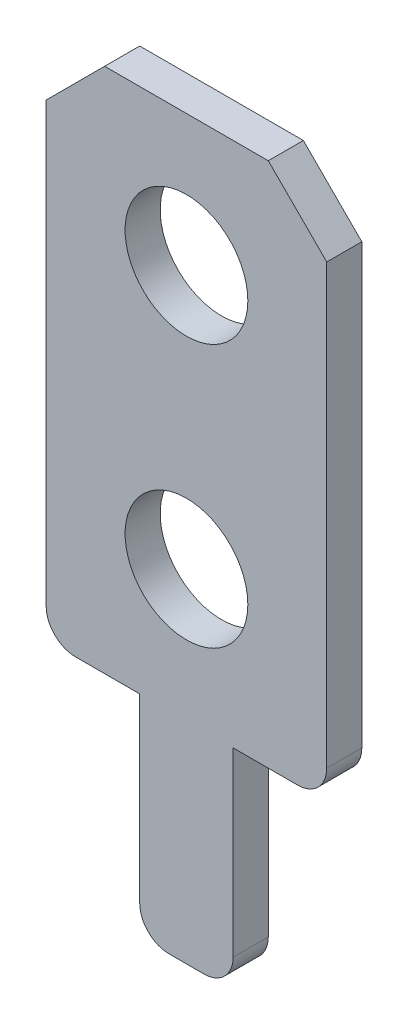
ISO-10303-21;
HEADER;
FILE_DESCRIPTION(('STEP AP214'),'2;1');
FILE_NAME('part.step','',(''),(''),'','','');
FILE_SCHEMA(('AUTOMOTIVE_DESIGN { 1 0 10303 214 1 1 1 1 }'));
ENDSEC;
DATA;
#1=APPLICATION_CONTEXT('core data for automotive mechanical design processes');
#2=APPLICATION_PROTOCOL_DEFINITION('international standard','automotive_design',2000,#1);
#3=PRODUCT_CONTEXT('',#1,'mechanical');
#4=PRODUCT('Part','Part','',(#3));
#5=PRODUCT_RELATED_PRODUCT_CATEGORY('part','',(#4));
#6=PRODUCT_DEFINITION_FORMATION('','',#4);
#7=PRODUCT_DEFINITION_CONTEXT('part definition',#1,'design');
#8=PRODUCT_DEFINITION('design','',#6,#7);
#9=PRODUCT_DEFINITION_SHAPE('','',#8);
#10=(LENGTH_UNIT() NAMED_UNIT(*) SI_UNIT(.MILLI.,.METRE.));
#11=(NAMED_UNIT(*) PLANE_ANGLE_UNIT() SI_UNIT($,.RADIAN.));
#12=(NAMED_UNIT(*) SI_UNIT($,.STERADIAN.) SOLID_ANGLE_UNIT());
#13=UNCERTAINTY_MEASURE_WITH_UNIT(LENGTH_MEASURE(1.E-05),#10,'distance_accuracy_value','');
#14=(GEOMETRIC_REPRESENTATION_CONTEXT(3) GLOBAL_UNCERTAINTY_ASSIGNED_CONTEXT((#13)) GLOBAL_UNIT_ASSIGNED_CONTEXT((#10,
#11,#12)) REPRESENTATION_CONTEXT('',''));
#15=CARTESIAN_POINT('',(0.,0.,0.));
#16=DIRECTION('',(0.,0.,1.));
#17=DIRECTION('',(1.,0.,0.));
#18=AXIS2_PLACEMENT_3D('',#15,#16,#17);
#19=CARTESIAN_POINT('',(0.,0.,0.6));
#20=DIRECTION('',(0.,0.,1.));
#21=DIRECTION('',(1.,0.,0.));
#22=AXIS2_PLACEMENT_3D('',#19,#20,#21);
#23=PLANE('',#22);
#24=CARTESIAN_POINT('',(0.,6.75,0.6));
#25=DIRECTION('',(0.,0.,1.));
#26=DIRECTION('',(1.,0.,0.));
#27=AXIS2_PLACEMENT_3D('',#24,#25,#26);
#28=CIRCLE('',#27,1.05);
#29=CARTESIAN_POINT('',(1.05,6.75,0.6));
#30=VERTEX_POINT('',#29);
#31=EDGE_CURVE('E205',#30,#30,#28,.F.);
#32=ORIENTED_EDGE('',*,*,#31,.T.);
#33=EDGE_LOOP('',(#32));
#34=FACE_BOUND('',#33,.T.);
#35=CARTESIAN_POINT('',(0.,2.25,0.6));
#36=DIRECTION('',(0.,0.,1.));
#37=DIRECTION('',(1.,0.,0.));
#38=AXIS2_PLACEMENT_3D('',#35,#36,#37);
#39=CIRCLE('',#38,1.05);
#40=CARTESIAN_POINT('',(1.05,2.25,0.6));
#41=VERTEX_POINT('',#40);
#42=EDGE_CURVE('E208',#41,#41,#39,.F.);
#43=ORIENTED_EDGE('',*,*,#42,.T.);
#44=EDGE_LOOP('',(#43));
#45=FACE_BOUND('',#44,.T.);
#46=DIRECTION('',(0.,1.,0.));
#47=VECTOR('',#46,1.);
#48=CARTESIAN_POINT('',(-2.4,9.,0.6));
#49=LINE('',#48,#47);
#50=CARTESIAN_POINT('',(-2.4,0.5,0.6));
#51=VERTEX_POINT('',#50);
#52=CARTESIAN_POINT('',(-2.4,8.,0.6));
#53=VERTEX_POINT('',#52);
#54=EDGE_CURVE('E129',#51,#53,#49,.T.);
#55=ORIENTED_EDGE('',*,*,#54,.F.);
#56=CARTESIAN_POINT('',(-1.9,0.5,0.6));
#57=DIRECTION('',(0.,0.,-1.));
#58=DIRECTION('',(-1.,0.,0.));
#59=AXIS2_PLACEMENT_3D('',#56,#57,#58);
#60=CIRCLE('',#59,0.5);
#61=CARTESIAN_POINT('',(-1.9,0.,0.6));
#62=VERTEX_POINT('',#61);
#63=EDGE_CURVE('E20',#62,#51,#60,.T.);
#64=ORIENTED_EDGE('',*,*,#63,.F.);
#65=DIRECTION('',(1.,0.,0.));
#66=VECTOR('',#65,1.);
#67=CARTESIAN_POINT('',(-2.4,0.,0.6));
#68=LINE('',#67,#66);
#69=CARTESIAN_POINT('',(-0.8,0.,0.6));
#70=VERTEX_POINT('',#69);
#71=EDGE_CURVE('E115',#70,#62,#68,.F.);
#72=ORIENTED_EDGE('',*,*,#71,.F.);
#73=DIRECTION('',(0.,1.,0.));
#74=VECTOR('',#73,1.);
#75=CARTESIAN_POINT('',(-0.8,0.,0.6));
#76=LINE('',#75,#74);
#77=CARTESIAN_POINT('',(-0.8,-3.1,0.6));
#78=VERTEX_POINT('',#77);
#79=EDGE_CURVE('E136',#78,#70,#76,.T.);
#80=ORIENTED_EDGE('',*,*,#79,.F.);
#81=CARTESIAN_POINT('',(-0.3,-3.1,0.6));
#82=DIRECTION('',(0.,0.,-1.));
#83=DIRECTION('',(-1.,0.,0.));
#84=AXIS2_PLACEMENT_3D('',#81,#82,#83);
#85=CIRCLE('',#84,0.5);
#86=CARTESIAN_POINT('',(-0.3,-3.6,0.6));
#87=VERTEX_POINT('',#86);
#88=EDGE_CURVE('E215',#87,#78,#85,.T.);
#89=ORIENTED_EDGE('',*,*,#88,.F.);
#90=DIRECTION('',(1.,0.,0.));
#91=VECTOR('',#90,1.);
#92=CARTESIAN_POINT('',(-0.8,-3.6,0.6));
#93=LINE('',#92,#91);
#94=CARTESIAN_POINT('',(0.3,-3.6,0.6));
#95=VERTEX_POINT('',#94);
#96=EDGE_CURVE('E178',#95,#87,#93,.F.);
#97=ORIENTED_EDGE('',*,*,#96,.F.);
#98=CARTESIAN_POINT('',(0.3,-3.1,0.6));
#99=DIRECTION('',(0.,0.,-1.));
#100=DIRECTION('',(-1.,0.,0.));
#101=AXIS2_PLACEMENT_3D('',#98,#99,#100);
#102=CIRCLE('',#101,0.5);
#103=CARTESIAN_POINT('',(0.8,-3.1,0.6));
#104=VERTEX_POINT('',#103);
#105=EDGE_CURVE('E214',#104,#95,#102,.T.);
#106=ORIENTED_EDGE('',*,*,#105,.F.);
#107=DIRECTION('',(0.,1.,0.));
#108=VECTOR('',#107,1.);
#109=CARTESIAN_POINT('',(0.8,-3.6,0.6));
#110=LINE('',#109,#108);
#111=CARTESIAN_POINT('',(0.8,0.,0.6));
#112=VERTEX_POINT('',#111);
#113=EDGE_CURVE('E173',#112,#104,#110,.F.);
#114=ORIENTED_EDGE('',*,*,#113,.F.);
#115=DIRECTION('',(1.,0.,0.));
#116=VECTOR('',#115,1.);
#117=CARTESIAN_POINT('',(0.8,0.,0.6));
#118=LINE('',#117,#116);
#119=CARTESIAN_POINT('',(1.9,0.,0.6));
#120=VERTEX_POINT('',#119);
#121=EDGE_CURVE('E167',#120,#112,#118,.F.);
#122=ORIENTED_EDGE('',*,*,#121,.F.);
#123=CARTESIAN_POINT('',(1.9,0.5,0.6));
#124=DIRECTION('',(0.,0.,-1.));
#125=DIRECTION('',(-1.,0.,0.));
#126=AXIS2_PLACEMENT_3D('',#123,#124,#125);
#127=CIRCLE('',#126,0.5);
#128=CARTESIAN_POINT('',(2.4,0.5,0.6));
#129=VERTEX_POINT('',#128);
#130=EDGE_CURVE('E212',#129,#120,#127,.T.);
#131=ORIENTED_EDGE('',*,*,#130,.F.);
#132=DIRECTION('',(0.,1.,0.));
#133=VECTOR('',#132,1.);
#134=CARTESIAN_POINT('',(2.4,0.,0.6));
#135=LINE('',#134,#133);
#136=CARTESIAN_POINT('',(2.4,8.,0.6));
#137=VERTEX_POINT('',#136);
#138=EDGE_CURVE('E162',#137,#129,#135,.F.);
#139=ORIENTED_EDGE('',*,*,#138,.F.);
#140=DIRECTION('',(-0.707106781186548,0.707106781186548,0.));
#141=VECTOR('',#140,1.);
#142=CARTESIAN_POINT('',(1.9,8.5,0.6));
#143=LINE('',#142,#141);
#144=CARTESIAN_POINT('',(1.4,9.,0.6));
#145=VERTEX_POINT('',#144);
#146=EDGE_CURVE('E157',#145,#137,#143,.F.);
#147=ORIENTED_EDGE('',*,*,#146,.F.);
#148=DIRECTION('',(1.,0.,0.));
#149=VECTOR('',#148,1.);
#150=CARTESIAN_POINT('',(2.4,9.,0.6));
#151=LINE('',#150,#149);
#152=CARTESIAN_POINT('',(-1.4,9.,0.6));
#153=VERTEX_POINT('',#152);
#154=EDGE_CURVE('E152',#153,#145,#151,.T.);
#155=ORIENTED_EDGE('',*,*,#154,.F.);
#156=DIRECTION('',(-0.707106781186548,-0.707106781186548,0.));
#157=VECTOR('',#156,1.);
#158=CARTESIAN_POINT('',(-1.9,8.5,0.6));
#159=LINE('',#158,#157);
#160=EDGE_CURVE('E147',#53,#153,#159,.F.);
#161=ORIENTED_EDGE('',*,*,#160,.F.);
#162=EDGE_LOOP('',(#55,#64,#72,#80,#89,#97,#106,#114,#122,#131,#139,#147,#155,#161));
#163=FACE_BOUND('',#162,.T.);
#164=ADVANCED_FACE('F17',(#34,#45,#163),#23,.T.);
#165=CARTESIAN_POINT('',(-1.9,0.5,1.38216));
#166=DIRECTION('',(0.,0.,-1.));
#167=DIRECTION('',(-1.,0.,0.));
#168=AXIS2_PLACEMENT_3D('',#165,#166,#167);
#169=CYLINDRICAL_SURFACE('',#168,0.5);
#170=DIRECTION('',(0.,0.,1.));
#171=VECTOR('',#170,1.);
#172=CARTESIAN_POINT('',(-2.4,0.5,0.));
#173=LINE('',#172,#171);
#174=CARTESIAN_POINT('',(-2.4,0.5,0.));
#175=VERTEX_POINT('',#174);
#176=EDGE_CURVE('E211',#175,#51,#173,.T.);
#177=ORIENTED_EDGE('',*,*,#176,.F.);
#178=CARTESIAN_POINT('',(-1.9,0.5,0.));
#179=DIRECTION('',(0.,0.,-1.));
#180=DIRECTION('',(-1.,0.,0.));
#181=AXIS2_PLACEMENT_3D('',#178,#179,#180);
#182=CIRCLE('',#181,0.5);
#183=CARTESIAN_POINT('',(-1.9,0.,0.));
#184=VERTEX_POINT('',#183);
#185=EDGE_CURVE('E135',#175,#184,#182,.F.);
#186=ORIENTED_EDGE('',*,*,#185,.T.);
#187=DIRECTION('',(0.,0.,-1.));
#188=VECTOR('',#187,1.);
#189=CARTESIAN_POINT('',(-1.9,0.,0.));
#190=LINE('',#189,#188);
#191=EDGE_CURVE('E120',#62,#184,#190,.T.);
#192=ORIENTED_EDGE('',*,*,#191,.F.);
#193=ORIENTED_EDGE('',*,*,#63,.T.);
#194=EDGE_LOOP('',(#177,#186,#192,#193));
#195=FACE_BOUND('',#194,.T.);
#196=ADVANCED_FACE('F134',(#195),#169,.T.);
#197=CARTESIAN_POINT('',(-2.4,0.,0.));
#198=DIRECTION('',(0.,-1.,0.));
#199=DIRECTION('',(0.,0.,-1.));
#200=AXIS2_PLACEMENT_3D('',#197,#198,#199);
#201=PLANE('',#200);
#202=ORIENTED_EDGE('',*,*,#71,.T.);
#203=ORIENTED_EDGE('',*,*,#191,.T.);
#204=DIRECTION('',(1.,0.,0.));
#205=VECTOR('',#204,1.);
#206=CARTESIAN_POINT('',(0.,0.,0.));
#207=LINE('',#206,#205);
#208=CARTESIAN_POINT('',(-0.8,0.,0.));
#209=VERTEX_POINT('',#208);
#210=EDGE_CURVE('E204',#184,#209,#207,.T.);
#211=ORIENTED_EDGE('',*,*,#210,.T.);
#212=DIRECTION('',(0.,0.,1.));
#213=VECTOR('',#212,1.);
#214=CARTESIAN_POINT('',(-0.8,0.,0.));
#215=LINE('',#214,#213);
#216=EDGE_CURVE('E122',#70,#209,#215,.F.);
#217=ORIENTED_EDGE('',*,*,#216,.F.);
#218=EDGE_LOOP('',(#202,#203,#211,#217));
#219=FACE_BOUND('',#218,.T.);
#220=ADVANCED_FACE('F117',(#219),#201,.T.);
#221=CARTESIAN_POINT('',(-0.8,0.,0.));
#222=DIRECTION('',(-1.,0.,0.));
#223=DIRECTION('',(0.,0.,1.));
#224=AXIS2_PLACEMENT_3D('',#221,#222,#223);
#225=PLANE('',#224);
#226=DIRECTION('',(0.,1.,0.));
#227=VECTOR('',#226,1.);
#228=CARTESIAN_POINT('',(-0.8,0.,0.));
#229=LINE('',#228,#227);
#230=CARTESIAN_POINT('',(-0.8,-3.1,0.));
#231=VERTEX_POINT('',#230);
#232=EDGE_CURVE('E202',#209,#231,#229,.F.);
#233=ORIENTED_EDGE('',*,*,#232,.T.);
#234=DIRECTION('',(0.,0.,-1.));
#235=VECTOR('',#234,1.);
#236=CARTESIAN_POINT('',(-0.8,-3.1,1.38216));
#237=LINE('',#236,#235);
#238=EDGE_CURVE('E180',#78,#231,#237,.T.);
#239=ORIENTED_EDGE('',*,*,#238,.F.);
#240=ORIENTED_EDGE('',*,*,#79,.T.);
#241=ORIENTED_EDGE('',*,*,#216,.T.);
#242=EDGE_LOOP('',(#233,#239,#240,#241));
#243=FACE_BOUND('',#242,.T.);
#244=ADVANCED_FACE('F331',(#243),#225,.T.);
#245=CARTESIAN_POINT('',(-0.3,-3.1,1.38216));
#246=DIRECTION('',(0.,0.,-1.));
#247=DIRECTION('',(-1.,0.,0.));
#248=AXIS2_PLACEMENT_3D('',#245,#246,#247);
#249=CYLINDRICAL_SURFACE('',#248,0.5);
#250=ORIENTED_EDGE('',*,*,#238,.T.);
#251=CARTESIAN_POINT('',(-0.3,-3.1,0.));
#252=DIRECTION('',(0.,0.,-1.));
#253=DIRECTION('',(-1.,0.,0.));
#254=AXIS2_PLACEMENT_3D('',#251,#252,#253);
#255=CIRCLE('',#254,0.5);
#256=CARTESIAN_POINT('',(-0.3,-3.6,0.));
#257=VERTEX_POINT('',#256);
#258=EDGE_CURVE('E199',#231,#257,#255,.F.);
#259=ORIENTED_EDGE('',*,*,#258,.T.);
#260=DIRECTION('',(0.,0.,-1.));
#261=VECTOR('',#260,1.);
#262=CARTESIAN_POINT('',(-0.3,-3.6,0.));
#263=LINE('',#262,#261);
#264=EDGE_CURVE('E179',#87,#257,#263,.T.);
#265=ORIENTED_EDGE('',*,*,#264,.F.);
#266=ORIENTED_EDGE('',*,*,#88,.T.);
#267=EDGE_LOOP('',(#250,#259,#265,#266));
#268=FACE_BOUND('',#267,.T.);
#269=ADVANCED_FACE('F329',(#268),#249,.T.);
#270=CARTESIAN_POINT('',(-0.8,-3.6,0.));
#271=DIRECTION('',(0.,-1.,0.));
#272=DIRECTION('',(0.,0.,-1.));
#273=AXIS2_PLACEMENT_3D('',#270,#271,#272);
#274=PLANE('',#273);
#275=ORIENTED_EDGE('',*,*,#96,.T.);
#276=ORIENTED_EDGE('',*,*,#264,.T.);
#277=DIRECTION('',(1.,0.,0.));
#278=VECTOR('',#277,1.);
#279=CARTESIAN_POINT('',(0.,-3.6,0.));
#280=LINE('',#279,#278);
#281=CARTESIAN_POINT('',(0.3,-3.6,0.));
#282=VERTEX_POINT('',#281);
#283=EDGE_CURVE('E198',#257,#282,#280,.T.);
#284=ORIENTED_EDGE('',*,*,#283,.T.);
#285=DIRECTION('',(0.,0.,-1.));
#286=VECTOR('',#285,1.);
#287=CARTESIAN_POINT('',(0.3,-3.6,1.38216));
#288=LINE('',#287,#286);
#289=EDGE_CURVE('E175',#95,#282,#288,.T.);
#290=ORIENTED_EDGE('',*,*,#289,.F.);
#291=EDGE_LOOP('',(#275,#276,#284,#290));
#292=FACE_BOUND('',#291,.T.);
#293=ADVANCED_FACE('F328',(#292),#274,.T.);
#294=CARTESIAN_POINT('',(0.3,-3.1,1.38216));
#295=DIRECTION('',(0.,0.,-1.));
#296=DIRECTION('',(-1.,0.,0.));
#297=AXIS2_PLACEMENT_3D('',#294,#295,#296);
#298=CYLINDRICAL_SURFACE('',#297,0.5);
#299=ORIENTED_EDGE('',*,*,#289,.T.);
#300=CARTESIAN_POINT('',(0.3,-3.1,0.));
#301=DIRECTION('',(0.,0.,-1.));
#302=DIRECTION('',(-1.,0.,0.));
#303=AXIS2_PLACEMENT_3D('',#300,#301,#302);
#304=CIRCLE('',#303,0.5);
#305=CARTESIAN_POINT('',(0.8,-3.1,0.));
#306=VERTEX_POINT('',#305);
#307=EDGE_CURVE('E194',#282,#306,#304,.F.);
#308=ORIENTED_EDGE('',*,*,#307,.T.);
#309=DIRECTION('',(0.,0.,-1.));
#310=VECTOR('',#309,1.);
#311=CARTESIAN_POINT('',(0.8,-3.1,0.));
#312=LINE('',#311,#310);
#313=EDGE_CURVE('E170',#104,#306,#312,.T.);
#314=ORIENTED_EDGE('',*,*,#313,.F.);
#315=ORIENTED_EDGE('',*,*,#105,.T.);
#316=EDGE_LOOP('',(#299,#308,#314,#315));
#317=FACE_BOUND('',#316,.T.);
#318=ADVANCED_FACE('F322',(#317),#298,.T.);
#319=CARTESIAN_POINT('',(0.8,-3.6,0.));
#320=DIRECTION('',(1.,0.,0.));
#321=DIRECTION('',(0.,0.,-1.));
#322=AXIS2_PLACEMENT_3D('',#319,#320,#321);
#323=PLANE('',#322);
#324=ORIENTED_EDGE('',*,*,#113,.T.);
#325=ORIENTED_EDGE('',*,*,#313,.T.);
#326=DIRECTION('',(0.,1.,0.));
#327=VECTOR('',#326,1.);
#328=CARTESIAN_POINT('',(0.8,0.,0.));
#329=LINE('',#328,#327);
#330=CARTESIAN_POINT('',(0.8,0.,0.));
#331=VERTEX_POINT('',#330);
#332=EDGE_CURVE('E197',#306,#331,#329,.T.);
#333=ORIENTED_EDGE('',*,*,#332,.T.);
#334=DIRECTION('',(0.,0.,-1.));
#335=VECTOR('',#334,1.);
#336=CARTESIAN_POINT('',(0.8,0.,0.));
#337=LINE('',#336,#335);
#338=EDGE_CURVE('E169',#112,#331,#337,.T.);
#339=ORIENTED_EDGE('',*,*,#338,.F.);
#340=EDGE_LOOP('',(#324,#325,#333,#339));
#341=FACE_BOUND('',#340,.T.);
#342=ADVANCED_FACE('F318',(#341),#323,.T.);
#343=CARTESIAN_POINT('',(0.8,0.,0.));
#344=DIRECTION('',(0.,-1.,0.));
#345=DIRECTION('',(0.,0.,-1.));
#346=AXIS2_PLACEMENT_3D('',#343,#344,#345);
#347=PLANE('',#346);
#348=DIRECTION('',(1.,0.,0.));
#349=VECTOR('',#348,1.);
#350=CARTESIAN_POINT('',(0.,0.,0.));
#351=LINE('',#350,#349);
#352=CARTESIAN_POINT('',(1.9,0.,0.));
#353=VERTEX_POINT('',#352);
#354=EDGE_CURVE('E193',#331,#353,#351,.T.);
#355=ORIENTED_EDGE('',*,*,#354,.T.);
#356=DIRECTION('',(0.,0.,-1.));
#357=VECTOR('',#356,1.);
#358=CARTESIAN_POINT('',(1.9,0.,1.38216));
#359=LINE('',#358,#357);
#360=EDGE_CURVE('E164',#120,#353,#359,.T.);
#361=ORIENTED_EDGE('',*,*,#360,.F.);
#362=ORIENTED_EDGE('',*,*,#121,.T.);
#363=ORIENTED_EDGE('',*,*,#338,.T.);
#364=EDGE_LOOP('',(#355,#361,#362,#363));
#365=FACE_BOUND('',#364,.T.);
#366=ADVANCED_FACE('F312',(#365),#347,.T.);
#367=CARTESIAN_POINT('',(1.9,0.5,1.38216));
#368=DIRECTION('',(0.,0.,-1.));
#369=DIRECTION('',(-1.,0.,0.));
#370=AXIS2_PLACEMENT_3D('',#367,#368,#369);
#371=CYLINDRICAL_SURFACE('',#370,0.5);
#372=ORIENTED_EDGE('',*,*,#360,.T.);
#373=CARTESIAN_POINT('',(1.9,0.5,0.));
#374=DIRECTION('',(0.,0.,-1.));
#375=DIRECTION('',(-1.,0.,0.));
#376=AXIS2_PLACEMENT_3D('',#373,#374,#375);
#377=CIRCLE('',#376,0.5);
#378=CARTESIAN_POINT('',(2.4,0.5,0.));
#379=VERTEX_POINT('',#378);
#380=EDGE_CURVE('E189',#353,#379,#377,.F.);
#381=ORIENTED_EDGE('',*,*,#380,.T.);
#382=DIRECTION('',(0.,0.,-1.));
#383=VECTOR('',#382,1.);
#384=CARTESIAN_POINT('',(2.4,0.5,0.));
#385=LINE('',#384,#383);
#386=EDGE_CURVE('E159',#129,#379,#385,.T.);
#387=ORIENTED_EDGE('',*,*,#386,.F.);
#388=ORIENTED_EDGE('',*,*,#130,.T.);
#389=EDGE_LOOP('',(#372,#381,#387,#388));
#390=FACE_BOUND('',#389,.T.);
#391=ADVANCED_FACE('F308',(#390),#371,.T.);
#392=CARTESIAN_POINT('',(2.4,0.,0.));
#393=DIRECTION('',(1.,0.,0.));
#394=DIRECTION('',(0.,0.,-1.));
#395=AXIS2_PLACEMENT_3D('',#392,#393,#394);
#396=PLANE('',#395);
#397=ORIENTED_EDGE('',*,*,#138,.T.);
#398=ORIENTED_EDGE('',*,*,#386,.T.);
#399=DIRECTION('',(0.,1.,0.));
#400=VECTOR('',#399,1.);
#401=CARTESIAN_POINT('',(2.4,0.,0.));
#402=LINE('',#401,#400);
#403=CARTESIAN_POINT('',(2.4,8.,0.));
#404=VERTEX_POINT('',#403);
#405=EDGE_CURVE('E192',#379,#404,#402,.T.);
#406=ORIENTED_EDGE('',*,*,#405,.T.);
#407=DIRECTION('',(0.,0.,1.));
#408=VECTOR('',#407,1.);
#409=CARTESIAN_POINT('',(2.4,8.,0.3));
#410=LINE('',#409,#408);
#411=EDGE_CURVE('E154',#137,#404,#410,.F.);
#412=ORIENTED_EDGE('',*,*,#411,.F.);
#413=EDGE_LOOP('',(#397,#398,#406,#412));
#414=FACE_BOUND('',#413,.T.);
#415=ADVANCED_FACE('F302',(#414),#396,.T.);
#416=CARTESIAN_POINT('',(1.9,8.5,0.3));
#417=DIRECTION('',(0.707106781186548,0.707106781186548,0.));
#418=DIRECTION('',(-0.707106781186548,0.707106781186548,0.));
#419=AXIS2_PLACEMENT_3D('',#416,#417,#418);
#420=PLANE('',#419);
#421=ORIENTED_EDGE('',*,*,#411,.T.);
#422=DIRECTION('',(-0.707106781186547,0.707106781186548,0.));
#423=VECTOR('',#422,1.);
#424=CARTESIAN_POINT('',(2.4,8.,0.));
#425=LINE('',#424,#423);
#426=CARTESIAN_POINT('',(1.4,9.,0.));
#427=VERTEX_POINT('',#426);
#428=EDGE_CURVE('E237',#404,#427,#425,.T.);
#429=ORIENTED_EDGE('',*,*,#428,.T.);
#430=DIRECTION('',(0.,0.,1.));
#431=VECTOR('',#430,1.);
#432=CARTESIAN_POINT('',(1.4,9.,0.));
#433=LINE('',#432,#431);
#434=EDGE_CURVE('E149',#145,#427,#433,.F.);
#435=ORIENTED_EDGE('',*,*,#434,.F.);
#436=ORIENTED_EDGE('',*,*,#146,.T.);
#437=EDGE_LOOP('',(#421,#429,#435,#436));
#438=FACE_BOUND('',#437,.T.);
#439=ADVANCED_FACE('F298',(#438),#420,.T.);
#440=CARTESIAN_POINT('',(2.4,9.,0.));
#441=DIRECTION('',(0.,1.,0.));
#442=DIRECTION('',(0.,0.,1.));
#443=AXIS2_PLACEMENT_3D('',#440,#441,#442);
#444=PLANE('',#443);
#445=DIRECTION('',(1.,0.,0.));
#446=VECTOR('',#445,1.);
#447=CARTESIAN_POINT('',(0.,9.,0.));
#448=LINE('',#447,#446);
#449=CARTESIAN_POINT('',(-1.4,9.,0.));
#450=VERTEX_POINT('',#449);
#451=EDGE_CURVE('E240',#427,#450,#448,.F.);
#452=ORIENTED_EDGE('',*,*,#451,.T.);
#453=DIRECTION('',(0.,0.,1.));
#454=VECTOR('',#453,1.);
#455=CARTESIAN_POINT('',(-1.4,9.,0.3));
#456=LINE('',#455,#454);
#457=EDGE_CURVE('E144',#153,#450,#456,.F.);
#458=ORIENTED_EDGE('',*,*,#457,.F.);
#459=ORIENTED_EDGE('',*,*,#154,.T.);
#460=ORIENTED_EDGE('',*,*,#434,.T.);
#461=EDGE_LOOP('',(#452,#458,#459,#460));
#462=FACE_BOUND('',#461,.T.);
#463=ADVANCED_FACE('F292',(#462),#444,.T.);
#464=CARTESIAN_POINT('',(-1.9,8.5,0.3));
#465=DIRECTION('',(-0.707106781186548,0.707106781186548,0.));
#466=DIRECTION('',(-0.707106781186548,-0.707106781186548,0.));
#467=AXIS2_PLACEMENT_3D('',#464,#465,#466);
#468=PLANE('',#467);
#469=ORIENTED_EDGE('',*,*,#457,.T.);
#470=DIRECTION('',(-0.707106781186547,-0.707106781186548,0.));
#471=VECTOR('',#470,1.);
#472=CARTESIAN_POINT('',(-1.4,9.,0.));
#473=LINE('',#472,#471);
#474=CARTESIAN_POINT('',(-2.4,8.,0.));
#475=VERTEX_POINT('',#474);
#476=EDGE_CURVE('E248',#450,#475,#473,.T.);
#477=ORIENTED_EDGE('',*,*,#476,.T.);
#478=DIRECTION('',(0.,0.,1.));
#479=VECTOR('',#478,1.);
#480=CARTESIAN_POINT('',(-2.4,8.,0.));
#481=LINE('',#480,#479);
#482=EDGE_CURVE('E35',#53,#475,#481,.F.);
#483=ORIENTED_EDGE('',*,*,#482,.F.);
#484=ORIENTED_EDGE('',*,*,#160,.T.);
#485=EDGE_LOOP('',(#469,#477,#483,#484));
#486=FACE_BOUND('',#485,.T.);
#487=ADVANCED_FACE('F288',(#486),#468,.T.);
#488=CARTESIAN_POINT('',(-2.4,9.,0.));
#489=DIRECTION('',(-1.,0.,0.));
#490=DIRECTION('',(0.,0.,1.));
#491=AXIS2_PLACEMENT_3D('',#488,#489,#490);
#492=PLANE('',#491);
#493=DIRECTION('',(0.,1.,0.));
#494=VECTOR('',#493,1.);
#495=CARTESIAN_POINT('',(-2.4,0.,0.));
#496=LINE('',#495,#494);
#497=EDGE_CURVE('E188',#475,#175,#496,.F.);
#498=ORIENTED_EDGE('',*,*,#497,.T.);
#499=ORIENTED_EDGE('',*,*,#176,.T.);
#500=ORIENTED_EDGE('',*,*,#54,.T.);
#501=ORIENTED_EDGE('',*,*,#482,.T.);
#502=EDGE_LOOP('',(#498,#499,#500,#501));
#503=FACE_BOUND('',#502,.T.);
#504=ADVANCED_FACE('F282',(#503),#492,.T.);
#505=CARTESIAN_POINT('',(0.,2.25,0.));
#506=DIRECTION('',(0.,0.,1.));
#507=DIRECTION('',(1.,0.,0.));
#508=AXIS2_PLACEMENT_3D('',#505,#506,#507);
#509=CYLINDRICAL_SURFACE('',#508,1.05);
#510=ORIENTED_EDGE('',*,*,#42,.F.);
#511=EDGE_LOOP('',(#510));
#512=FACE_BOUND('',#511,.T.);
#513=CARTESIAN_POINT('',(0.,2.25,0.));
#514=DIRECTION('',(0.,0.,1.));
#515=DIRECTION('',(1.,0.,0.));
#516=AXIS2_PLACEMENT_3D('',#513,#514,#515);
#517=CIRCLE('',#516,1.05);
#518=CARTESIAN_POINT('',(1.05,2.25,0.));
#519=VERTEX_POINT('',#518);
#520=EDGE_CURVE('E26',#519,#519,#517,.F.);
#521=ORIENTED_EDGE('',*,*,#520,.T.);
#522=EDGE_LOOP('',(#521));
#523=FACE_BOUND('',#522,.T.);
#524=ADVANCED_FACE('F348',(#512,#523),#509,.F.);
#525=CARTESIAN_POINT('',(0.,6.75,0.));
#526=DIRECTION('',(0.,0.,1.));
#527=DIRECTION('',(1.,0.,0.));
#528=AXIS2_PLACEMENT_3D('',#525,#526,#527);
#529=CYLINDRICAL_SURFACE('',#528,1.05);
#530=ORIENTED_EDGE('',*,*,#31,.F.);
#531=EDGE_LOOP('',(#530));
#532=FACE_BOUND('',#531,.T.);
#533=CARTESIAN_POINT('',(0.,6.75,0.));
#534=DIRECTION('',(0.,0.,1.));
#535=DIRECTION('',(1.,0.,0.));
#536=AXIS2_PLACEMENT_3D('',#533,#534,#535);
#537=CIRCLE('',#536,1.05);
#538=CARTESIAN_POINT('',(1.05,6.75,0.));
#539=VERTEX_POINT('',#538);
#540=EDGE_CURVE('E11',#539,#539,#537,.F.);
#541=ORIENTED_EDGE('',*,*,#540,.T.);
#542=EDGE_LOOP('',(#541));
#543=FACE_BOUND('',#542,.T.);
#544=ADVANCED_FACE('F342',(#532,#543),#529,.F.);
#545=CARTESIAN_POINT('',(0.,0.,0.));
#546=DIRECTION('',(0.,0.,1.));
#547=DIRECTION('',(1.,0.,0.));
#548=AXIS2_PLACEMENT_3D('',#545,#546,#547);
#549=PLANE('',#548);
#550=ORIENTED_EDGE('',*,*,#540,.F.);
#551=EDGE_LOOP('',(#550));
#552=FACE_BOUND('',#551,.T.);
#553=ORIENTED_EDGE('',*,*,#520,.F.);
#554=EDGE_LOOP('',(#553));
#555=FACE_BOUND('',#554,.T.);
#556=ORIENTED_EDGE('',*,*,#476,.F.);
#557=ORIENTED_EDGE('',*,*,#451,.F.);
#558=ORIENTED_EDGE('',*,*,#428,.F.);
#559=ORIENTED_EDGE('',*,*,#405,.F.);
#560=ORIENTED_EDGE('',*,*,#380,.F.);
#561=ORIENTED_EDGE('',*,*,#354,.F.);
#562=ORIENTED_EDGE('',*,*,#332,.F.);
#563=ORIENTED_EDGE('',*,*,#307,.F.);
#564=ORIENTED_EDGE('',*,*,#283,.F.);
#565=ORIENTED_EDGE('',*,*,#258,.F.);
#566=ORIENTED_EDGE('',*,*,#232,.F.);
#567=ORIENTED_EDGE('',*,*,#210,.F.);
#568=ORIENTED_EDGE('',*,*,#185,.F.);
#569=ORIENTED_EDGE('',*,*,#497,.F.);
#570=EDGE_LOOP('',(#556,#557,#558,#559,#560,#561,#562,#563,#564,#565,#566,#567,#568,#569));
#571=FACE_BOUND('',#570,.T.);
#572=ADVANCED_FACE('F285',(#552,#555,#571),#549,.F.);
#573=CLOSED_SHELL('',(#164,#196,#220,#244,#269,#293,#318,#342,#366,#391,#415,#439,#463,#487,
#504,#524,#544,#572));
#574=MANIFOLD_SOLID_BREP('B1',#573);
#575=ADVANCED_BREP_SHAPE_REPRESENTATION('',(#18,#574),#14);
#576=SHAPE_DEFINITION_REPRESENTATION(#9,#575);
ENDSEC;
END-ISO-10303-21;
